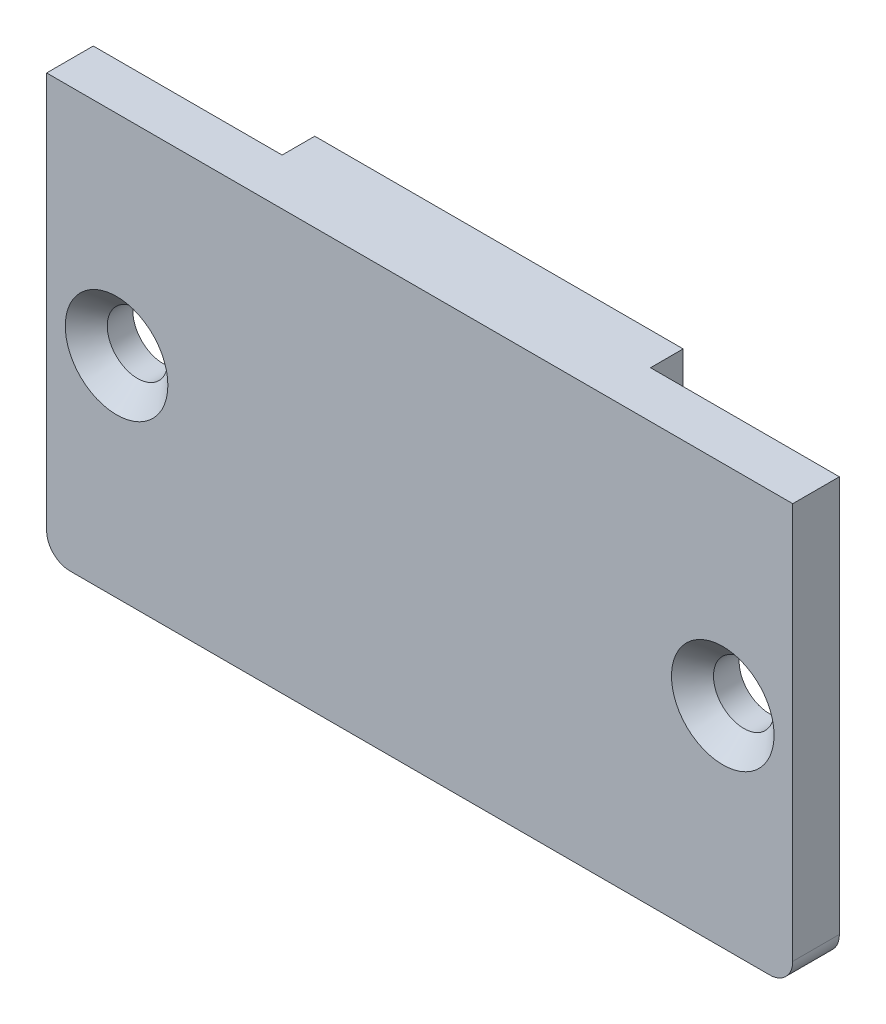
ISO-10303-21;
HEADER;
FILE_DESCRIPTION(('STEP AP214'),'2;1');
FILE_NAME('part.step','',(''),(''),'','','');
FILE_SCHEMA(('AUTOMOTIVE_DESIGN { 1 0 10303 214 1 1 1 1 }'));
ENDSEC;
DATA;
#1=APPLICATION_CONTEXT('core data for automotive mechanical design processes');
#2=APPLICATION_PROTOCOL_DEFINITION('international standard','automotive_design',2000,#1);
#3=PRODUCT_CONTEXT('',#1,'mechanical');
#4=PRODUCT('Part','Part','',(#3));
#5=PRODUCT_RELATED_PRODUCT_CATEGORY('part','',(#4));
#6=PRODUCT_DEFINITION_FORMATION('','',#4);
#7=PRODUCT_DEFINITION_CONTEXT('part definition',#1,'design');
#8=PRODUCT_DEFINITION('design','',#6,#7);
#9=PRODUCT_DEFINITION_SHAPE('','',#8);
#10=(LENGTH_UNIT() NAMED_UNIT(*) SI_UNIT(.MILLI.,.METRE.));
#11=(NAMED_UNIT(*) PLANE_ANGLE_UNIT() SI_UNIT($,.RADIAN.));
#12=(NAMED_UNIT(*) SI_UNIT($,.STERADIAN.) SOLID_ANGLE_UNIT());
#13=UNCERTAINTY_MEASURE_WITH_UNIT(LENGTH_MEASURE(1.E-05),#10,'distance_accuracy_value','');
#14=(GEOMETRIC_REPRESENTATION_CONTEXT(3) GLOBAL_UNCERTAINTY_ASSIGNED_CONTEXT((#13)) GLOBAL_UNIT_ASSIGNED_CONTEXT((#10,
#11,#12)) REPRESENTATION_CONTEXT('',''));
#15=CARTESIAN_POINT('',(0.,0.,0.));
#16=DIRECTION('',(0.,0.,1.));
#17=DIRECTION('',(1.,0.,0.));
#18=AXIS2_PLACEMENT_3D('',#15,#16,#17);
#19=CARTESIAN_POINT('',(0.,0.,0.));
#20=DIRECTION('',(0.,0.,-1.));
#21=DIRECTION('',(-1.,0.,0.));
#22=AXIS2_PLACEMENT_3D('',#19,#20,#21);
#23=PLANE('',#22);
#24=DIRECTION('',(0.,1.,0.));
#25=VECTOR('',#24,1.);
#26=CARTESIAN_POINT('',(16.,-9.,0.));
#27=LINE('',#26,#25);
#28=CARTESIAN_POINT('',(16.,-8.,0.));
#29=VERTEX_POINT('',#28);
#30=CARTESIAN_POINT('',(16.,9.,0.));
#31=VERTEX_POINT('',#30);
#32=EDGE_CURVE('E273',#29,#31,#27,.T.);
#33=ORIENTED_EDGE('',*,*,#32,.F.);
#34=CARTESIAN_POINT('',(15.,-8.,0.));
#35=DIRECTION('',(0.,0.,-1.));
#36=DIRECTION('',(-1.,0.,0.));
#37=AXIS2_PLACEMENT_3D('',#34,#35,#36);
#38=CIRCLE('',#37,1.);
#39=CARTESIAN_POINT('',(15.,-9.,0.));
#40=VERTEX_POINT('',#39);
#41=EDGE_CURVE('E306',#29,#40,#38,.T.);
#42=ORIENTED_EDGE('',*,*,#41,.T.);
#43=DIRECTION('',(1.,0.,0.));
#44=VECTOR('',#43,1.);
#45=CARTESIAN_POINT('',(-16.,-9.,0.));
#46=LINE('',#45,#44);
#47=CARTESIAN_POINT('',(-15.,-9.,0.));
#48=VERTEX_POINT('',#47);
#49=EDGE_CURVE('E277',#48,#40,#46,.T.);
#50=ORIENTED_EDGE('',*,*,#49,.F.);
#51=CARTESIAN_POINT('',(-15.,-8.,0.));
#52=DIRECTION('',(0.,0.,-1.));
#53=DIRECTION('',(-1.,0.,0.));
#54=AXIS2_PLACEMENT_3D('',#51,#52,#53);
#55=CIRCLE('',#54,1.);
#56=CARTESIAN_POINT('',(-16.,-8.,0.));
#57=VERTEX_POINT('',#56);
#58=EDGE_CURVE('E304',#48,#57,#55,.T.);
#59=ORIENTED_EDGE('',*,*,#58,.T.);
#60=DIRECTION('',(0.,-1.,0.));
#61=VECTOR('',#60,1.);
#62=CARTESIAN_POINT('',(-16.,-9.,0.));
#63=LINE('',#62,#61);
#64=CARTESIAN_POINT('',(-16.,9.,0.));
#65=VERTEX_POINT('',#64);
#66=EDGE_CURVE('E289',#65,#57,#63,.T.);
#67=ORIENTED_EDGE('',*,*,#66,.F.);
#68=DIRECTION('',(-1.,0.,0.));
#69=VECTOR('',#68,1.);
#70=CARTESIAN_POINT('',(-16.,9.,0.));
#71=LINE('',#70,#69);
#72=CARTESIAN_POINT('',(-7.9,9.,0.));
#73=VERTEX_POINT('',#72);
#74=EDGE_CURVE('E285',#73,#65,#71,.T.);
#75=ORIENTED_EDGE('',*,*,#74,.F.);
#76=DIRECTION('',(0.,1.,0.));
#77=VECTOR('',#76,1.);
#78=CARTESIAN_POINT('',(-7.9,9.,0.));
#79=LINE('',#78,#77);
#80=CARTESIAN_POINT('',(-7.9,7.,0.));
#81=VERTEX_POINT('',#80);
#82=EDGE_CURVE('E216',#81,#73,#79,.T.);
#83=ORIENTED_EDGE('',*,*,#82,.F.);
#84=DIRECTION('',(1.,0.,0.));
#85=VECTOR('',#84,1.);
#86=CARTESIAN_POINT('',(9.5,7.,0.));
#87=LINE('',#86,#85);
#88=CARTESIAN_POINT('',(-9.6,6.99999999999999,0.));
#89=VERTEX_POINT('',#88);
#90=EDGE_CURVE('E262',#89,#81,#87,.T.);
#91=ORIENTED_EDGE('',*,*,#90,.F.);
#92=DIRECTION('',(0.,1.,0.));
#93=VECTOR('',#92,1.);
#94=CARTESIAN_POINT('',(-9.60000000000001,0.,0.));
#95=LINE('',#94,#93);
#96=CARTESIAN_POINT('',(-9.6,5.8,0.));
#97=VERTEX_POINT('',#96);
#98=EDGE_CURVE('E194',#97,#89,#95,.T.);
#99=ORIENTED_EDGE('',*,*,#98,.F.);
#100=DIRECTION('',(-1.,0.,0.));
#101=VECTOR('',#100,1.);
#102=CARTESIAN_POINT('',(0.,5.8,0.));
#103=LINE('',#102,#101);
#104=CARTESIAN_POINT('',(-9.5,5.8,0.));
#105=VERTEX_POINT('',#104);
#106=EDGE_CURVE('E210',#105,#97,#103,.T.);
#107=ORIENTED_EDGE('',*,*,#106,.F.);
#108=DIRECTION('',(0.,1.,0.));
#109=VECTOR('',#108,1.);
#110=CARTESIAN_POINT('',(-9.5,-7.,0.));
#111=LINE('',#110,#109);
#112=CARTESIAN_POINT('',(-9.5,-7.,0.));
#113=VERTEX_POINT('',#112);
#114=EDGE_CURVE('E258',#113,#105,#111,.T.);
#115=ORIENTED_EDGE('',*,*,#114,.F.);
#116=DIRECTION('',(-1.,0.,0.));
#117=VECTOR('',#116,1.);
#118=CARTESIAN_POINT('',(9.5,-7.,0.));
#119=LINE('',#118,#117);
#120=CARTESIAN_POINT('',(9.5,-7.,0.));
#121=VERTEX_POINT('',#120);
#122=EDGE_CURVE('E252',#121,#113,#119,.T.);
#123=ORIENTED_EDGE('',*,*,#122,.F.);
#124=DIRECTION('',(0.,-1.,0.));
#125=VECTOR('',#124,1.);
#126=CARTESIAN_POINT('',(9.5,-7.,0.));
#127=LINE('',#126,#125);
#128=CARTESIAN_POINT('',(9.5,5.8,0.));
#129=VERTEX_POINT('',#128);
#130=EDGE_CURVE('E264',#129,#121,#127,.T.);
#131=ORIENTED_EDGE('',*,*,#130,.F.);
#132=CARTESIAN_POINT('',(9.6,5.8,0.));
#133=VERTEX_POINT('',#132);
#134=EDGE_CURVE('E206',#133,#129,#103,.T.);
#135=ORIENTED_EDGE('',*,*,#134,.F.);
#136=DIRECTION('',(0.,-1.,0.));
#137=VECTOR('',#136,1.);
#138=CARTESIAN_POINT('',(9.60000000000001,0.,0.));
#139=LINE('',#138,#137);
#140=CARTESIAN_POINT('',(9.6,7.,0.));
#141=VERTEX_POINT('',#140);
#142=EDGE_CURVE('E214',#141,#133,#139,.T.);
#143=ORIENTED_EDGE('',*,*,#142,.F.);
#144=CARTESIAN_POINT('',(7.9,7.,0.));
#145=VERTEX_POINT('',#144);
#146=EDGE_CURVE('E261',#145,#141,#87,.T.);
#147=ORIENTED_EDGE('',*,*,#146,.F.);
#148=DIRECTION('',(0.,-1.,0.));
#149=VECTOR('',#148,1.);
#150=CARTESIAN_POINT('',(7.90000000000001,9.,0.));
#151=LINE('',#150,#149);
#152=CARTESIAN_POINT('',(7.90000000000001,9.,0.));
#153=VERTEX_POINT('',#152);
#154=EDGE_CURVE('E229',#153,#145,#151,.T.);
#155=ORIENTED_EDGE('',*,*,#154,.F.);
#156=EDGE_CURVE('E286',#31,#153,#71,.T.);
#157=ORIENTED_EDGE('',*,*,#156,.F.);
#158=EDGE_LOOP('',(#33,#42,#50,#59,#67,#75,#83,#91,#99,#107,#115,#123,#131,#135,#143,#147,#155,#157));
#159=FACE_BOUND('',#158,.T.);
#160=CARTESIAN_POINT('',(13.,0.,0.));
#161=DIRECTION('',(0.,0.,-1.));
#162=DIRECTION('',(-1.,0.,0.));
#163=AXIS2_PLACEMENT_3D('',#160,#161,#162);
#164=CIRCLE('',#163,1.3);
#165=CARTESIAN_POINT('',(11.7,0.,0.));
#166=VERTEX_POINT('',#165);
#167=EDGE_CURVE('E243',#166,#166,#164,.T.);
#168=ORIENTED_EDGE('',*,*,#167,.F.);
#169=EDGE_LOOP('',(#168));
#170=FACE_BOUND('',#169,.T.);
#171=CARTESIAN_POINT('',(-13.,0.,0.));
#172=DIRECTION('',(0.,0.,-1.));
#173=DIRECTION('',(-1.,0.,0.));
#174=AXIS2_PLACEMENT_3D('',#171,#172,#173);
#175=CIRCLE('',#174,1.3);
#176=CARTESIAN_POINT('',(-14.3,0.,0.));
#177=VERTEX_POINT('',#176);
#178=EDGE_CURVE('E250',#177,#177,#175,.T.);
#179=ORIENTED_EDGE('',*,*,#178,.F.);
#180=EDGE_LOOP('',(#179));
#181=FACE_BOUND('',#180,.T.);
#182=ADVANCED_FACE('F41',(#159,#170,#181),#23,.T.);
#183=CARTESIAN_POINT('',(9.5,7.,-1.4));
#184=DIRECTION('',(0.,-1.,0.));
#185=DIRECTION('',(0.,0.,-1.));
#186=AXIS2_PLACEMENT_3D('',#183,#184,#185);
#187=PLANE('',#186);
#188=DIRECTION('',(0.,0.,1.));
#189=VECTOR('',#188,1.);
#190=CARTESIAN_POINT('',(7.9,7.,-17.3260792412948));
#191=LINE('',#190,#189);
#192=CARTESIAN_POINT('',(7.9,7.,-1.4));
#193=VERTEX_POINT('',#192);
#194=EDGE_CURVE('E232',#193,#145,#191,.T.);
#195=ORIENTED_EDGE('',*,*,#194,.T.);
#196=ORIENTED_EDGE('',*,*,#146,.T.);
#197=DIRECTION('',(0.,0.,1.));
#198=VECTOR('',#197,1.);
#199=CARTESIAN_POINT('',(9.6,7.,-20.6374634502577));
#200=LINE('',#199,#198);
#201=CARTESIAN_POINT('',(9.6,7.,-1.4));
#202=VERTEX_POINT('',#201);
#203=EDGE_CURVE('E196',#202,#141,#200,.T.);
#204=ORIENTED_EDGE('',*,*,#203,.F.);
#205=DIRECTION('',(1.,0.,0.));
#206=VECTOR('',#205,1.);
#207=CARTESIAN_POINT('',(9.5,7.,-1.4));
#208=LINE('',#207,#206);
#209=EDGE_CURVE('E178',#193,#202,#208,.T.);
#210=ORIENTED_EDGE('',*,*,#209,.F.);
#211=EDGE_LOOP('',(#195,#196,#204,#210));
#212=FACE_BOUND('',#211,.T.);
#213=ADVANCED_FACE('F350',(#212),#187,.F.);
#214=DIRECTION('',(0.,0.,1.));
#215=VECTOR('',#214,1.);
#216=CARTESIAN_POINT('',(-7.9,7.,-17.3260792412948));
#217=LINE('',#216,#215);
#218=CARTESIAN_POINT('',(-7.89999999999999,7.,-1.4));
#219=VERTEX_POINT('',#218);
#220=EDGE_CURVE('E175',#219,#81,#217,.T.);
#221=ORIENTED_EDGE('',*,*,#220,.F.);
#222=CARTESIAN_POINT('',(-9.6,6.99999999999999,-1.4));
#223=VERTEX_POINT('',#222);
#224=EDGE_CURVE('E169',#223,#219,#208,.T.);
#225=ORIENTED_EDGE('',*,*,#224,.F.);
#226=DIRECTION('',(0.,0.,1.));
#227=VECTOR('',#226,1.);
#228=CARTESIAN_POINT('',(-9.6,6.99999999999999,-20.6374634502577));
#229=LINE('',#228,#227);
#230=EDGE_CURVE('E174',#223,#89,#229,.T.);
#231=ORIENTED_EDGE('',*,*,#230,.T.);
#232=ORIENTED_EDGE('',*,*,#90,.T.);
#233=EDGE_LOOP('',(#221,#225,#231,#232));
#234=FACE_BOUND('',#233,.T.);
#235=ADVANCED_FACE('F171',(#234),#187,.F.);
#236=CARTESIAN_POINT('',(16.,-9.,2.));
#237=DIRECTION('',(-1.,0.,0.));
#238=DIRECTION('',(0.,0.,1.));
#239=AXIS2_PLACEMENT_3D('',#236,#237,#238);
#240=PLANE('',#239);
#241=DIRECTION('',(0.,1.,0.));
#242=VECTOR('',#241,1.);
#243=CARTESIAN_POINT('',(16.,-9.,2.));
#244=LINE('',#243,#242);
#245=CARTESIAN_POINT('',(16.,-8.,2.));
#246=VERTEX_POINT('',#245);
#247=CARTESIAN_POINT('',(16.,9.,2.));
#248=VERTEX_POINT('',#247);
#249=EDGE_CURVE('E274',#246,#248,#244,.T.);
#250=ORIENTED_EDGE('',*,*,#249,.F.);
#251=DIRECTION('',(0.,0.,-1.));
#252=VECTOR('',#251,1.);
#253=CARTESIAN_POINT('',(16.,-8.,2.));
#254=LINE('',#253,#252);
#255=EDGE_CURVE('E297',#246,#29,#254,.T.);
#256=ORIENTED_EDGE('',*,*,#255,.T.);
#257=ORIENTED_EDGE('',*,*,#32,.T.);
#258=DIRECTION('',(0.,0.,-1.));
#259=VECTOR('',#258,1.);
#260=CARTESIAN_POINT('',(16.,9.,2.));
#261=LINE('',#260,#259);
#262=EDGE_CURVE('E294',#248,#31,#261,.T.);
#263=ORIENTED_EDGE('',*,*,#262,.F.);
#264=EDGE_LOOP('',(#250,#256,#257,#263));
#265=FACE_BOUND('',#264,.T.);
#266=ADVANCED_FACE('F322',(#265),#240,.F.);
#267=CARTESIAN_POINT('',(-16.,9.,2.));
#268=DIRECTION('',(0.,-1.,0.));
#269=DIRECTION('',(0.,0.,-1.));
#270=AXIS2_PLACEMENT_3D('',#267,#268,#269);
#271=PLANE('',#270);
#272=ORIENTED_EDGE('',*,*,#156,.T.);
#273=DIRECTION('',(0.,0.,1.));
#274=VECTOR('',#273,1.);
#275=CARTESIAN_POINT('',(7.90000000000001,9.,-17.3260792412948));
#276=LINE('',#275,#274);
#277=CARTESIAN_POINT('',(7.90000000000001,9.,-1.4));
#278=VERTEX_POINT('',#277);
#279=EDGE_CURVE('E235',#278,#153,#276,.T.);
#280=ORIENTED_EDGE('',*,*,#279,.F.);
#281=DIRECTION('',(-1.,0.,0.));
#282=VECTOR('',#281,1.);
#283=CARTESIAN_POINT('',(7.90000000000001,9.,-1.4));
#284=LINE('',#283,#282);
#285=CARTESIAN_POINT('',(-7.9,9.,-1.4));
#286=VERTEX_POINT('',#285);
#287=EDGE_CURVE('E220',#278,#286,#284,.T.);
#288=ORIENTED_EDGE('',*,*,#287,.T.);
#289=DIRECTION('',(0.,0.,1.));
#290=VECTOR('',#289,1.);
#291=CARTESIAN_POINT('',(-7.9,9.,-17.3260792412948));
#292=LINE('',#291,#290);
#293=EDGE_CURVE('E221',#286,#73,#292,.T.);
#294=ORIENTED_EDGE('',*,*,#293,.T.);
#295=ORIENTED_EDGE('',*,*,#74,.T.);
#296=DIRECTION('',(0.,0.,-1.));
#297=VECTOR('',#296,1.);
#298=CARTESIAN_POINT('',(-16.,9.,2.));
#299=LINE('',#298,#297);
#300=CARTESIAN_POINT('',(-16.,9.,2.));
#301=VERTEX_POINT('',#300);
#302=EDGE_CURVE('E283',#301,#65,#299,.T.);
#303=ORIENTED_EDGE('',*,*,#302,.F.);
#304=DIRECTION('',(-1.,0.,0.));
#305=VECTOR('',#304,1.);
#306=CARTESIAN_POINT('',(-16.,9.,2.));
#307=LINE('',#306,#305);
#308=EDGE_CURVE('E276',#248,#301,#307,.T.);
#309=ORIENTED_EDGE('',*,*,#308,.F.);
#310=ORIENTED_EDGE('',*,*,#262,.T.);
#311=EDGE_LOOP('',(#272,#280,#288,#294,#295,#303,#309,#310));
#312=FACE_BOUND('',#311,.T.);
#313=ADVANCED_FACE('F338',(#312),#271,.F.);
#314=CARTESIAN_POINT('',(-16.,-9.,2.));
#315=DIRECTION('',(1.,0.,0.));
#316=DIRECTION('',(0.,0.,-1.));
#317=AXIS2_PLACEMENT_3D('',#314,#315,#316);
#318=PLANE('',#317);
#319=ORIENTED_EDGE('',*,*,#66,.T.);
#320=DIRECTION('',(0.,0.,-1.));
#321=VECTOR('',#320,1.);
#322=CARTESIAN_POINT('',(-16.,-8.,2.));
#323=LINE('',#322,#321);
#324=CARTESIAN_POINT('',(-16.,-8.,2.));
#325=VERTEX_POINT('',#324);
#326=EDGE_CURVE('E11',#57,#325,#323,.F.);
#327=ORIENTED_EDGE('',*,*,#326,.T.);
#328=DIRECTION('',(0.,-1.,0.));
#329=VECTOR('',#328,1.);
#330=CARTESIAN_POINT('',(-16.,-9.,2.));
#331=LINE('',#330,#329);
#332=EDGE_CURVE('E279',#301,#325,#331,.T.);
#333=ORIENTED_EDGE('',*,*,#332,.F.);
#334=ORIENTED_EDGE('',*,*,#302,.T.);
#335=EDGE_LOOP('',(#319,#327,#333,#334));
#336=FACE_BOUND('',#335,.T.);
#337=ADVANCED_FACE('F335',(#336),#318,.F.);
#338=CARTESIAN_POINT('',(-16.,-9.,2.));
#339=DIRECTION('',(0.,1.,0.));
#340=DIRECTION('',(0.,0.,1.));
#341=AXIS2_PLACEMENT_3D('',#338,#339,#340);
#342=PLANE('',#341);
#343=ORIENTED_EDGE('',*,*,#49,.T.);
#344=DIRECTION('',(0.,0.,-1.));
#345=VECTOR('',#344,1.);
#346=CARTESIAN_POINT('',(15.,-9.,2.));
#347=LINE('',#346,#345);
#348=CARTESIAN_POINT('',(15.,-9.,2.));
#349=VERTEX_POINT('',#348);
#350=EDGE_CURVE('E62',#40,#349,#347,.F.);
#351=ORIENTED_EDGE('',*,*,#350,.T.);
#352=DIRECTION('',(1.,0.,0.));
#353=VECTOR('',#352,1.);
#354=CARTESIAN_POINT('',(-16.,-9.,2.));
#355=LINE('',#354,#353);
#356=CARTESIAN_POINT('',(-15.,-9.,2.));
#357=VERTEX_POINT('',#356);
#358=EDGE_CURVE('E281',#357,#349,#355,.T.);
#359=ORIENTED_EDGE('',*,*,#358,.F.);
#360=DIRECTION('',(0.,0.,-1.));
#361=VECTOR('',#360,1.);
#362=CARTESIAN_POINT('',(-15.,-9.,2.));
#363=LINE('',#362,#361);
#364=EDGE_CURVE('E308',#357,#48,#363,.T.);
#365=ORIENTED_EDGE('',*,*,#364,.T.);
#366=EDGE_LOOP('',(#343,#351,#359,#365));
#367=FACE_BOUND('',#366,.T.);
#368=ADVANCED_FACE('F329',(#367),#342,.F.);
#369=CARTESIAN_POINT('',(0.,0.,2.));
#370=DIRECTION('',(0.,0.,-1.));
#371=DIRECTION('',(-1.,0.,0.));
#372=AXIS2_PLACEMENT_3D('',#369,#370,#371);
#373=PLANE('',#372);
#374=CARTESIAN_POINT('',(13.,0.,2.));
#375=DIRECTION('',(0.,0.,1.));
#376=DIRECTION('',(1.,0.,0.));
#377=AXIS2_PLACEMENT_3D('',#374,#375,#376);
#378=CIRCLE('',#377,2.2);
#379=CARTESIAN_POINT('',(15.2,0.,2.));
#380=VERTEX_POINT('',#379);
#381=EDGE_CURVE('E226',#380,#380,#378,.T.);
#382=ORIENTED_EDGE('',*,*,#381,.F.);
#383=EDGE_LOOP('',(#382));
#384=FACE_BOUND('',#383,.T.);
#385=CARTESIAN_POINT('',(-13.,0.,2.));
#386=DIRECTION('',(0.,0.,1.));
#387=DIRECTION('',(1.,0.,0.));
#388=AXIS2_PLACEMENT_3D('',#385,#386,#387);
#389=CIRCLE('',#388,2.2);
#390=CARTESIAN_POINT('',(-10.8,0.,2.));
#391=VERTEX_POINT('',#390);
#392=EDGE_CURVE('E244',#391,#391,#389,.T.);
#393=ORIENTED_EDGE('',*,*,#392,.F.);
#394=EDGE_LOOP('',(#393));
#395=FACE_BOUND('',#394,.T.);
#396=ORIENTED_EDGE('',*,*,#358,.T.);
#397=CARTESIAN_POINT('',(15.,-8.,2.));
#398=DIRECTION('',(0.,0.,-1.));
#399=DIRECTION('',(-1.,0.,0.));
#400=AXIS2_PLACEMENT_3D('',#397,#398,#399);
#401=CIRCLE('',#400,1.);
#402=EDGE_CURVE('E49',#349,#246,#401,.F.);
#403=ORIENTED_EDGE('',*,*,#402,.T.);
#404=ORIENTED_EDGE('',*,*,#249,.T.);
#405=ORIENTED_EDGE('',*,*,#308,.T.);
#406=ORIENTED_EDGE('',*,*,#332,.T.);
#407=CARTESIAN_POINT('',(-15.,-8.,2.));
#408=DIRECTION('',(0.,0.,-1.));
#409=DIRECTION('',(-1.,0.,0.));
#410=AXIS2_PLACEMENT_3D('',#407,#408,#409);
#411=CIRCLE('',#410,1.);
#412=EDGE_CURVE('E312',#325,#357,#411,.F.);
#413=ORIENTED_EDGE('',*,*,#412,.T.);
#414=EDGE_LOOP('',(#396,#403,#404,#405,#406,#413));
#415=FACE_BOUND('',#414,.T.);
#416=ADVANCED_FACE('F316',(#384,#395,#415),#373,.F.);
#417=CARTESIAN_POINT('',(-9.5,-7.,-1.4));
#418=DIRECTION('',(1.,0.,0.));
#419=DIRECTION('',(0.,0.,-1.));
#420=AXIS2_PLACEMENT_3D('',#417,#418,#419);
#421=PLANE('',#420);
#422=ORIENTED_EDGE('',*,*,#114,.T.);
#423=DIRECTION('',(0.,0.,-1.));
#424=VECTOR('',#423,1.);
#425=CARTESIAN_POINT('',(-9.5,5.8,-1.4));
#426=LINE('',#425,#424);
#427=CARTESIAN_POINT('',(-9.5,5.8,-1.4));
#428=VERTEX_POINT('',#427);
#429=EDGE_CURVE('E209',#105,#428,#426,.T.);
#430=ORIENTED_EDGE('',*,*,#429,.T.);
#431=DIRECTION('',(0.,1.,0.));
#432=VECTOR('',#431,1.);
#433=CARTESIAN_POINT('',(-9.5,-7.,-1.4));
#434=LINE('',#433,#432);
#435=CARTESIAN_POINT('',(-9.5,-7.,-1.4));
#436=VERTEX_POINT('',#435);
#437=EDGE_CURVE('E251',#436,#428,#434,.T.);
#438=ORIENTED_EDGE('',*,*,#437,.F.);
#439=DIRECTION('',(0.,0.,1.));
#440=VECTOR('',#439,1.);
#441=CARTESIAN_POINT('',(-9.5,-7.,-1.4));
#442=LINE('',#441,#440);
#443=EDGE_CURVE('E257',#436,#113,#442,.T.);
#444=ORIENTED_EDGE('',*,*,#443,.T.);
#445=EDGE_LOOP('',(#422,#430,#438,#444));
#446=FACE_BOUND('',#445,.T.);
#447=ADVANCED_FACE('F378',(#446),#421,.F.);
#448=CARTESIAN_POINT('',(9.5,-7.,-1.4));
#449=DIRECTION('',(-1.,0.,0.));
#450=DIRECTION('',(0.,0.,1.));
#451=AXIS2_PLACEMENT_3D('',#448,#449,#450);
#452=PLANE('',#451);
#453=DIRECTION('',(0.,-1.,0.));
#454=VECTOR('',#453,1.);
#455=CARTESIAN_POINT('',(9.5,-7.,-1.4));
#456=LINE('',#455,#454);
#457=CARTESIAN_POINT('',(9.5,5.8,-1.4));
#458=VERTEX_POINT('',#457);
#459=CARTESIAN_POINT('',(9.5,-7.,-1.4));
#460=VERTEX_POINT('',#459);
#461=EDGE_CURVE('E177',#458,#460,#456,.T.);
#462=ORIENTED_EDGE('',*,*,#461,.F.);
#463=DIRECTION('',(0.,0.,1.));
#464=VECTOR('',#463,1.);
#465=CARTESIAN_POINT('',(9.5,5.8,-1.4));
#466=LINE('',#465,#464);
#467=EDGE_CURVE('E203',#458,#129,#466,.T.);
#468=ORIENTED_EDGE('',*,*,#467,.T.);
#469=ORIENTED_EDGE('',*,*,#130,.T.);
#470=DIRECTION('',(0.,0.,1.));
#471=VECTOR('',#470,1.);
#472=CARTESIAN_POINT('',(9.5,-7.,-1.4));
#473=LINE('',#472,#471);
#474=EDGE_CURVE('E270',#460,#121,#473,.T.);
#475=ORIENTED_EDGE('',*,*,#474,.F.);
#476=EDGE_LOOP('',(#462,#468,#469,#475));
#477=FACE_BOUND('',#476,.T.);
#478=ADVANCED_FACE('F370',(#477),#452,.F.);
#479=CARTESIAN_POINT('',(9.5,-7.,-1.4));
#480=DIRECTION('',(0.,1.,0.));
#481=DIRECTION('',(0.,0.,1.));
#482=AXIS2_PLACEMENT_3D('',#479,#480,#481);
#483=PLANE('',#482);
#484=ORIENTED_EDGE('',*,*,#122,.T.);
#485=ORIENTED_EDGE('',*,*,#443,.F.);
#486=DIRECTION('',(-1.,0.,0.));
#487=VECTOR('',#486,1.);
#488=CARTESIAN_POINT('',(9.5,-7.,-1.4));
#489=LINE('',#488,#487);
#490=EDGE_CURVE('E255',#460,#436,#489,.T.);
#491=ORIENTED_EDGE('',*,*,#490,.F.);
#492=ORIENTED_EDGE('',*,*,#474,.T.);
#493=EDGE_LOOP('',(#484,#485,#491,#492));
#494=FACE_BOUND('',#493,.T.);
#495=ADVANCED_FACE('F375',(#494),#483,.F.);
#496=CARTESIAN_POINT('',(0.,0.,-1.4));
#497=DIRECTION('',(0.,0.,1.));
#498=DIRECTION('',(1.,0.,0.));
#499=AXIS2_PLACEMENT_3D('',#496,#497,#498);
#500=PLANE('',#499);
#501=DIRECTION('',(0.,1.,0.));
#502=VECTOR('',#501,1.);
#503=CARTESIAN_POINT('',(7.90000000000001,9.,-1.4));
#504=LINE('',#503,#502);
#505=EDGE_CURVE('E217',#193,#278,#504,.T.);
#506=ORIENTED_EDGE('',*,*,#505,.F.);
#507=ORIENTED_EDGE('',*,*,#209,.T.);
#508=DIRECTION('',(0.,-1.,0.));
#509=VECTOR('',#508,1.);
#510=CARTESIAN_POINT('',(9.6,7.,-1.4));
#511=LINE('',#510,#509);
#512=CARTESIAN_POINT('',(9.6,5.8,-1.4));
#513=VERTEX_POINT('',#512);
#514=EDGE_CURVE('E207',#202,#513,#511,.T.);
#515=ORIENTED_EDGE('',*,*,#514,.T.);
#516=DIRECTION('',(-1.,0.,0.));
#517=VECTOR('',#516,1.);
#518=CARTESIAN_POINT('',(9.6,5.8,-1.4));
#519=LINE('',#518,#517);
#520=EDGE_CURVE('E364',#513,#458,#519,.T.);
#521=ORIENTED_EDGE('',*,*,#520,.T.);
#522=ORIENTED_EDGE('',*,*,#461,.T.);
#523=ORIENTED_EDGE('',*,*,#490,.T.);
#524=ORIENTED_EDGE('',*,*,#437,.T.);
#525=CARTESIAN_POINT('',(-9.6,5.8,-1.4));
#526=VERTEX_POINT('',#525);
#527=EDGE_CURVE('E185',#428,#526,#519,.T.);
#528=ORIENTED_EDGE('',*,*,#527,.T.);
#529=DIRECTION('',(0.,1.,0.));
#530=VECTOR('',#529,1.);
#531=CARTESIAN_POINT('',(-9.6,6.99999999999999,-1.4));
#532=LINE('',#531,#530);
#533=EDGE_CURVE('E181',#526,#223,#532,.T.);
#534=ORIENTED_EDGE('',*,*,#533,.T.);
#535=ORIENTED_EDGE('',*,*,#224,.T.);
#536=DIRECTION('',(0.,-1.,0.));
#537=VECTOR('',#536,1.);
#538=CARTESIAN_POINT('',(-7.9,9.,-1.4));
#539=LINE('',#538,#537);
#540=EDGE_CURVE('E224',#286,#219,#539,.T.);
#541=ORIENTED_EDGE('',*,*,#540,.F.);
#542=ORIENTED_EDGE('',*,*,#287,.F.);
#543=EDGE_LOOP('',(#506,#507,#515,#521,#522,#523,#524,#528,#534,#535,#541,#542));
#544=FACE_BOUND('',#543,.T.);
#545=ADVANCED_FACE('F183',(#544),#500,.F.);
#546=CARTESIAN_POINT('',(-13.,0.,2.));
#547=DIRECTION('',(0.,0.,1.));
#548=DIRECTION('',(1.,0.,0.));
#549=AXIS2_PLACEMENT_3D('',#546,#547,#548);
#550=CYLINDRICAL_SURFACE('',#549,1.3);
#551=ORIENTED_EDGE('',*,*,#178,.T.);
#552=EDGE_LOOP('',(#551));
#553=FACE_BOUND('',#552,.T.);
#554=CARTESIAN_POINT('',(-13.,0.,1.1));
#555=DIRECTION('',(0.,0.,1.));
#556=DIRECTION('',(1.,0.,0.));
#557=AXIS2_PLACEMENT_3D('',#554,#555,#556);
#558=CIRCLE('',#557,1.3);
#559=CARTESIAN_POINT('',(-11.7,0.,1.1));
#560=VERTEX_POINT('',#559);
#561=EDGE_CURVE('E247',#560,#560,#558,.T.);
#562=ORIENTED_EDGE('',*,*,#561,.T.);
#563=EDGE_LOOP('',(#562));
#564=FACE_BOUND('',#563,.T.);
#565=ADVANCED_FACE('F451',(#553,#564),#550,.F.);
#566=CARTESIAN_POINT('',(-13.,0.,2.));
#567=DIRECTION('',(0.,0.,1.));
#568=DIRECTION('',(1.,0.,0.));
#569=AXIS2_PLACEMENT_3D('',#566,#567,#568);
#570=CONICAL_SURFACE('',#569,2.2,0.785398163397449);
#571=ORIENTED_EDGE('',*,*,#561,.F.);
#572=EDGE_LOOP('',(#571));
#573=FACE_BOUND('',#572,.T.);
#574=ORIENTED_EDGE('',*,*,#392,.T.);
#575=EDGE_LOOP('',(#574));
#576=FACE_BOUND('',#575,.T.);
#577=ADVANCED_FACE('F508',(#573,#576),#570,.F.);
#578=CARTESIAN_POINT('',(13.,0.,2.));
#579=DIRECTION('',(0.,0.,1.));
#580=DIRECTION('',(1.,0.,0.));
#581=AXIS2_PLACEMENT_3D('',#578,#579,#580);
#582=CYLINDRICAL_SURFACE('',#581,1.3);
#583=ORIENTED_EDGE('',*,*,#167,.T.);
#584=EDGE_LOOP('',(#583));
#585=FACE_BOUND('',#584,.T.);
#586=CARTESIAN_POINT('',(13.,0.,1.1));
#587=DIRECTION('',(0.,0.,1.));
#588=DIRECTION('',(1.,0.,0.));
#589=AXIS2_PLACEMENT_3D('',#586,#587,#588);
#590=CIRCLE('',#589,1.3);
#591=CARTESIAN_POINT('',(14.3,0.,1.1));
#592=VERTEX_POINT('',#591);
#593=EDGE_CURVE('E240',#592,#592,#590,.T.);
#594=ORIENTED_EDGE('',*,*,#593,.T.);
#595=EDGE_LOOP('',(#594));
#596=FACE_BOUND('',#595,.T.);
#597=ADVANCED_FACE('F500',(#585,#596),#582,.F.);
#598=CARTESIAN_POINT('',(13.,0.,2.));
#599=DIRECTION('',(0.,0.,1.));
#600=DIRECTION('',(1.,0.,0.));
#601=AXIS2_PLACEMENT_3D('',#598,#599,#600);
#602=CONICAL_SURFACE('',#601,2.2,0.785398163397449);
#603=ORIENTED_EDGE('',*,*,#593,.F.);
#604=EDGE_LOOP('',(#603));
#605=FACE_BOUND('',#604,.T.);
#606=ORIENTED_EDGE('',*,*,#381,.T.);
#607=EDGE_LOOP('',(#606));
#608=FACE_BOUND('',#607,.T.);
#609=ADVANCED_FACE('F487',(#605,#608),#602,.F.);
#610=CARTESIAN_POINT('',(7.90000000000001,9.,-17.3260792412948));
#611=DIRECTION('',(-1.,0.,0.));
#612=DIRECTION('',(0.,-1.,0.));
#613=AXIS2_PLACEMENT_3D('',#610,#611,#612);
#614=PLANE('',#613);
#615=ORIENTED_EDGE('',*,*,#194,.F.);
#616=ORIENTED_EDGE('',*,*,#505,.T.);
#617=ORIENTED_EDGE('',*,*,#279,.T.);
#618=ORIENTED_EDGE('',*,*,#154,.T.);
#619=EDGE_LOOP('',(#615,#616,#617,#618));
#620=FACE_BOUND('',#619,.T.);
#621=ADVANCED_FACE('F347',(#620),#614,.F.);
#622=CARTESIAN_POINT('',(-7.9,9.,-17.3260792412948));
#623=DIRECTION('',(1.,0.,0.));
#624=DIRECTION('',(0.,0.,-1.));
#625=AXIS2_PLACEMENT_3D('',#622,#623,#624);
#626=PLANE('',#625);
#627=ORIENTED_EDGE('',*,*,#293,.F.);
#628=ORIENTED_EDGE('',*,*,#540,.T.);
#629=ORIENTED_EDGE('',*,*,#220,.T.);
#630=ORIENTED_EDGE('',*,*,#82,.T.);
#631=EDGE_LOOP('',(#627,#628,#629,#630));
#632=FACE_BOUND('',#631,.T.);
#633=ADVANCED_FACE('F342',(#632),#626,.F.);
#634=CARTESIAN_POINT('',(9.6,5.8,-20.6374634502577));
#635=DIRECTION('',(0.,-1.,0.));
#636=DIRECTION('',(1.,0.,0.));
#637=AXIS2_PLACEMENT_3D('',#634,#635,#636);
#638=PLANE('',#637);
#639=DIRECTION('',(0.,0.,1.));
#640=VECTOR('',#639,1.);
#641=CARTESIAN_POINT('',(9.6,5.8,-20.6374634502577));
#642=LINE('',#641,#640);
#643=EDGE_CURVE('E189',#513,#133,#642,.T.);
#644=ORIENTED_EDGE('',*,*,#643,.T.);
#645=ORIENTED_EDGE('',*,*,#134,.T.);
#646=ORIENTED_EDGE('',*,*,#467,.F.);
#647=ORIENTED_EDGE('',*,*,#520,.F.);
#648=EDGE_LOOP('',(#644,#645,#646,#647));
#649=FACE_BOUND('',#648,.T.);
#650=ADVANCED_FACE('F362',(#649),#638,.T.);
#651=CARTESIAN_POINT('',(9.6,7.,-20.6374634502577));
#652=DIRECTION('',(1.,0.,0.));
#653=DIRECTION('',(0.,1.,0.));
#654=AXIS2_PLACEMENT_3D('',#651,#652,#653);
#655=PLANE('',#654);
#656=ORIENTED_EDGE('',*,*,#203,.T.);
#657=ORIENTED_EDGE('',*,*,#142,.T.);
#658=ORIENTED_EDGE('',*,*,#643,.F.);
#659=ORIENTED_EDGE('',*,*,#514,.F.);
#660=EDGE_LOOP('',(#656,#657,#658,#659));
#661=FACE_BOUND('',#660,.T.);
#662=ADVANCED_FACE('F358',(#661),#655,.T.);
#663=ORIENTED_EDGE('',*,*,#429,.F.);
#664=ORIENTED_EDGE('',*,*,#106,.T.);
#665=DIRECTION('',(0.,0.,1.));
#666=VECTOR('',#665,1.);
#667=CARTESIAN_POINT('',(-9.6,5.8,-20.6374634502577));
#668=LINE('',#667,#666);
#669=EDGE_CURVE('E195',#526,#97,#668,.T.);
#670=ORIENTED_EDGE('',*,*,#669,.F.);
#671=ORIENTED_EDGE('',*,*,#527,.F.);
#672=EDGE_LOOP('',(#663,#664,#670,#671));
#673=FACE_BOUND('',#672,.T.);
#674=ADVANCED_FACE('F381',(#673),#638,.T.);
#675=CARTESIAN_POINT('',(-9.6,6.99999999999999,-20.6374634502577));
#676=DIRECTION('',(-1.,0.,0.));
#677=DIRECTION('',(0.,-1.,0.));
#678=AXIS2_PLACEMENT_3D('',#675,#676,#677);
#679=PLANE('',#678);
#680=ORIENTED_EDGE('',*,*,#669,.T.);
#681=ORIENTED_EDGE('',*,*,#98,.T.);
#682=ORIENTED_EDGE('',*,*,#230,.F.);
#683=ORIENTED_EDGE('',*,*,#533,.F.);
#684=EDGE_LOOP('',(#680,#681,#682,#683));
#685=FACE_BOUND('',#684,.T.);
#686=ADVANCED_FACE('F192',(#685),#679,.T.);
#687=CARTESIAN_POINT('',(15.,-8.,2.));
#688=DIRECTION('',(0.,0.,-1.));
#689=DIRECTION('',(-1.,0.,0.));
#690=AXIS2_PLACEMENT_3D('',#687,#688,#689);
#691=CYLINDRICAL_SURFACE('',#690,1.);
#692=ORIENTED_EDGE('',*,*,#402,.F.);
#693=ORIENTED_EDGE('',*,*,#350,.F.);
#694=ORIENTED_EDGE('',*,*,#41,.F.);
#695=ORIENTED_EDGE('',*,*,#255,.F.);
#696=EDGE_LOOP('',(#692,#693,#694,#695));
#697=FACE_BOUND('',#696,.T.);
#698=ADVANCED_FACE('F324',(#697),#691,.T.);
#699=CARTESIAN_POINT('',(-15.,-8.,2.));
#700=DIRECTION('',(0.,0.,-1.));
#701=DIRECTION('',(-1.,0.,0.));
#702=AXIS2_PLACEMENT_3D('',#699,#700,#701);
#703=CYLINDRICAL_SURFACE('',#702,1.);
#704=ORIENTED_EDGE('',*,*,#412,.F.);
#705=ORIENTED_EDGE('',*,*,#326,.F.);
#706=ORIENTED_EDGE('',*,*,#58,.F.);
#707=ORIENTED_EDGE('',*,*,#364,.F.);
#708=EDGE_LOOP('',(#704,#705,#706,#707));
#709=FACE_BOUND('',#708,.T.);
#710=ADVANCED_FACE('F43',(#709),#703,.T.);
#711=CLOSED_SHELL('',(#182,#213,#235,#266,#313,#337,#368,#416,#447,#478,#495,#545,#565,#577,
#597,#609,#621,#633,#650,#662,#674,#686,#698,#710));
#712=MANIFOLD_SOLID_BREP('B2',#711);
#713=ADVANCED_BREP_SHAPE_REPRESENTATION('',(#18,#712),#14);
#714=SHAPE_DEFINITION_REPRESENTATION(#9,#713);
ENDSEC;
END-ISO-10303-21;
